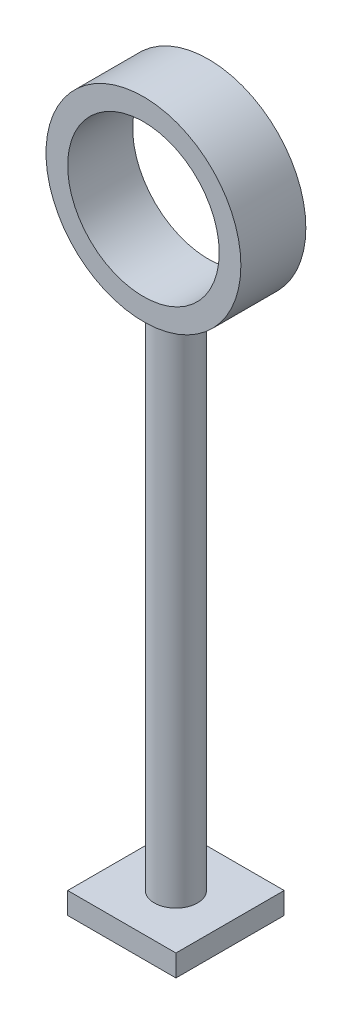
ISO-10303-21;
HEADER;
FILE_DESCRIPTION(('STEP AP214'),'2;1');
FILE_NAME('part.step','',(''),(''),'','','');
FILE_SCHEMA(('AUTOMOTIVE_DESIGN { 1 0 10303 214 1 1 1 1 }'));
ENDSEC;
DATA;
#1=APPLICATION_CONTEXT('core data for automotive mechanical design processes');
#2=APPLICATION_PROTOCOL_DEFINITION('international standard','automotive_design',2000,#1);
#3=PRODUCT_CONTEXT('',#1,'mechanical');
#4=PRODUCT('Part','Part','',(#3));
#5=PRODUCT_RELATED_PRODUCT_CATEGORY('part','',(#4));
#6=PRODUCT_DEFINITION_FORMATION('','',#4);
#7=PRODUCT_DEFINITION_CONTEXT('part definition',#1,'design');
#8=PRODUCT_DEFINITION('design','',#6,#7);
#9=PRODUCT_DEFINITION_SHAPE('','',#8);
#10=(LENGTH_UNIT() NAMED_UNIT(*) SI_UNIT(.MILLI.,.METRE.));
#11=(NAMED_UNIT(*) PLANE_ANGLE_UNIT() SI_UNIT($,.RADIAN.));
#12=(NAMED_UNIT(*) SI_UNIT($,.STERADIAN.) SOLID_ANGLE_UNIT());
#13=UNCERTAINTY_MEASURE_WITH_UNIT(LENGTH_MEASURE(1.E-05),#10,'distance_accuracy_value','');
#14=(GEOMETRIC_REPRESENTATION_CONTEXT(3) GLOBAL_UNCERTAINTY_ASSIGNED_CONTEXT((#13)) GLOBAL_UNIT_ASSIGNED_CONTEXT((#10,
#11,#12)) REPRESENTATION_CONTEXT('',''));
#15=CARTESIAN_POINT('',(0.,0.,0.));
#16=DIRECTION('',(0.,0.,1.));
#17=DIRECTION('',(1.,0.,0.));
#18=AXIS2_PLACEMENT_3D('',#15,#16,#17);
#19=CARTESIAN_POINT('',(0.,0.,15.));
#20=DIRECTION('',(0.,0.,-1.));
#21=DIRECTION('',(-1.,0.,0.));
#22=AXIS2_PLACEMENT_3D('',#19,#20,#21);
#23=CYLINDRICAL_SURFACE('',#22,22.5);
#24=CARTESIAN_POINT('',(0.,0.,15.));
#25=DIRECTION('',(0.,0.,1.));
#26=DIRECTION('',(1.,0.,0.));
#27=AXIS2_PLACEMENT_3D('',#24,#25,#26);
#28=CIRCLE('',#27,22.5);
#29=CARTESIAN_POINT('',(22.5,0.,15.));
#30=VERTEX_POINT('',#29);
#31=EDGE_CURVE('E50',#30,#30,#28,.T.);
#32=ORIENTED_EDGE('',*,*,#31,.F.);
#33=EDGE_LOOP('',(#32));
#34=FACE_BOUND('',#33,.T.);
#35=CARTESIAN_POINT('',(0.,0.,0.));
#36=DIRECTION('',(0.,0.,1.));
#37=DIRECTION('',(1.,0.,0.));
#38=AXIS2_PLACEMENT_3D('',#35,#36,#37);
#39=CIRCLE('',#38,22.5);
#40=CARTESIAN_POINT('',(22.5,0.,0.));
#41=VERTEX_POINT('',#40);
#42=EDGE_CURVE('E124',#41,#41,#39,.T.);
#43=ORIENTED_EDGE('',*,*,#42,.T.);
#44=EDGE_LOOP('',(#43));
#45=FACE_BOUND('',#44,.T.);
#46=CARTESIAN_POINT('',(0.,-22.5,2.5));
#47=CARTESIAN_POINT('',(0.277201191939121,-22.4999949054563,2.50000930919956));
#48=CARTESIAN_POINT('',(0.55451391317405,-22.4948253498923,2.52312995415872));
#49=CARTESIAN_POINT('',(1.10125486025783,-22.4747024439418,2.61490118087639));
#50=CARTESIAN_POINT('',(1.37067743784747,-22.4597422554339,2.68358358502321));
#51=CARTESIAN_POINT('',(1.89365819440382,-22.421702829225,2.86421492622913));
#52=CARTESIAN_POINT('',(2.14723288025071,-22.3986322109764,2.97611794249466));
#53=CARTESIAN_POINT('',(2.63200045078441,-22.3468583860351,3.23986653118103));
#54=CARTESIAN_POINT('',(2.86319376983337,-22.3181552886865,3.3917113282266));
#55=CARTESIAN_POINT('',(3.30046578503508,-22.2577273543527,3.73368916276663));
#56=CARTESIAN_POINT('',(3.50612153010881,-22.2259640410261,3.92435625533762));
#57=CARTESIAN_POINT('',(3.88281227614596,-22.1632650270043,4.33742015023309));
#58=CARTESIAN_POINT('',(4.05384411027149,-22.132329402237,4.55981985177703));
#59=CARTESIAN_POINT('',(4.35831108525865,-22.0744082065066,5.03317961014484));
#60=CARTESIAN_POINT('',(4.49129355260967,-22.0474718934386,5.28443739510044));
#61=CARTESIAN_POINT('',(4.71298247386312,-22.0011524089458,5.80643190423444));
#62=CARTESIAN_POINT('',(4.80169440550397,-21.9817683031266,6.07716621377329));
#63=CARTESIAN_POINT('',(4.93092145016118,-21.9531402359799,6.62583369330533));
#64=CARTESIAN_POINT('',(4.97218667594937,-21.9437386433446,6.90358178774013));
#65=CARTESIAN_POINT('',(5.00768177493916,-21.9356668414217,7.46220554443613));
#66=CARTESIAN_POINT('',(5.00191762279196,-21.9369952689832,7.74308080489217));
#67=CARTESIAN_POINT('',(4.94412068793337,-21.9500908041844,8.29439156798603));
#68=CARTESIAN_POINT('',(4.89296161150565,-21.9616607847499,8.56492406034877));
#69=CARTESIAN_POINT('',(4.74721226702843,-21.993623854663,9.0934678583121));
#70=CARTESIAN_POINT('',(4.65261949204123,-22.0140174532947,9.35147844021339));
#71=CARTESIAN_POINT('',(4.42189182182193,-22.0615227492924,9.85009859595482));
#72=CARTESIAN_POINT('',(4.28542298448383,-22.0886881090716,10.0905483183402));
#73=CARTESIAN_POINT('',(3.97505170349622,-22.1466434477592,10.5454571762897));
#74=CARTESIAN_POINT('',(3.80114400185685,-22.1774339355124,10.7599126545504));
#75=CARTESIAN_POINT('',(3.41621709257458,-22.2400143653192,11.1617732733712));
#76=CARTESIAN_POINT('',(3.20445551316558,-22.2718112671975,11.3484669627626));
#77=CARTESIAN_POINT('',(2.75226654522905,-22.3321959780572,11.6838093222678));
#78=CARTESIAN_POINT('',(2.51183860459343,-22.3607837252105,11.8324572594547));
#79=CARTESIAN_POINT('',(2.00825797683684,-22.4116266058404,12.087673189442));
#80=CARTESIAN_POINT('',(1.74505530579964,-22.4338673251915,12.1941456107706));
#81=CARTESIAN_POINT('',(1.20388982745364,-22.4694034091563,12.3611525326447));
#82=CARTESIAN_POINT('',(0.925929243983414,-22.4827001174196,12.4216939335353));
#83=CARTESIAN_POINT('',(0.369238708202113,-22.4986579440418,12.4940800331379));
#84=CARTESIAN_POINT('',(0.0906409932972646,-22.5015312155572,12.5068962504042));
#85=CARTESIAN_POINT('',(-0.464714809820198,-22.496913966265,12.4861047393491));
#86=CARTESIAN_POINT('',(-0.741473025676616,-22.4894241722617,12.4525002667014));
#87=CARTESIAN_POINT('',(-1.28205814332355,-22.4650564689652,12.3406264620798));
#88=CARTESIAN_POINT('',(-1.5459962292887,-22.4482861751934,12.2628688594414));
#89=CARTESIAN_POINT('',(-2.05708201463959,-22.4072355271705,12.0654657813873));
#90=CARTESIAN_POINT('',(-2.30422825002548,-22.3829545191188,11.9458166592349));
#91=CARTESIAN_POINT('',(-2.77871609973591,-22.3290538306887,11.6660178080026));
#92=CARTESIAN_POINT('',(-3.00571432708049,-22.2993611147475,11.505300142485));
#93=CARTESIAN_POINT('',(-3.42986741247043,-22.2380758087357,11.148671877246));
#94=CARTESIAN_POINT('',(-3.6270182543358,-22.2064829637869,10.9527565491682));
#95=CARTESIAN_POINT('',(-3.98973870477415,-22.1442219736121,10.5268299160498));
#96=CARTESIAN_POINT('',(-4.1546345485,-22.1135829414823,10.2962397749894));
#97=CARTESIAN_POINT('',(-4.44336529807064,-22.0573848845825,9.81006991396707));
#98=CARTESIAN_POINT('',(-4.5672019981812,-22.0318256378478,9.55449128662275));
#99=CARTESIAN_POINT('',(-4.76945004740288,-21.9889300132591,9.02697927725065));
#100=CARTESIAN_POINT('',(-4.84811965884861,-21.9715469897688,8.755148894392));
#101=CARTESIAN_POINT('',(-4.95855069144011,-21.9468912408989,8.20168953791624));
#102=CARTESIAN_POINT('',(-4.99031989295584,-21.9396168385988,7.92006219746525));
#103=CARTESIAN_POINT('',(-5.00570891602905,-21.936110036307,7.36180280427664));
#104=CARTESIAN_POINT('',(-4.99039782859127,-21.9396324581123,7.0852012298064));
#105=CARTESIAN_POINT('',(-4.91445692803306,-21.956766622574,6.53862572505049));
#106=CARTESIAN_POINT('',(-4.85382768500485,-21.9703782383105,6.26865171143571));
#107=CARTESIAN_POINT('',(-4.68949549952189,-22.0060357036517,5.74387719944398));
#108=CARTESIAN_POINT('',(-4.58595291571222,-22.0280501296667,5.48902420779935));
#109=CARTESIAN_POINT('',(-4.33886925870767,-22.078044111629,5.00015001862985));
#110=CARTESIAN_POINT('',(-4.1953238646296,-22.1060243118894,4.76613107508908));
#111=CARTESIAN_POINT('',(-3.8687839747642,-22.1655260709102,4.320308477631));
#112=CARTESIAN_POINT('',(-3.68502963777603,-22.1971092842007,4.10906948769362));
#113=CARTESIAN_POINT('',(-3.28482176486254,-22.2598493543275,3.72007481517144));
#114=CARTESIAN_POINT('',(-3.06836066558357,-22.2910061107244,3.5423268987289));
#115=CARTESIAN_POINT('',(-2.60536492661394,-22.3498814931665,3.22306004270026));
#116=CARTESIAN_POINT('',(-2.35846409158738,-22.3775480874812,3.08206200066269));
#117=CARTESIAN_POINT('',(-1.84390069944704,-22.4258014592307,2.84379173954696));
#118=CARTESIAN_POINT('',(-1.57625550828249,-22.4463940817703,2.74648339988458));
#119=CARTESIAN_POINT('',(-1.09034561932353,-22.474570322739,2.61539662430803));
#120=CARTESIAN_POINT('',(-0.874679979754206,-22.4840467255803,2.57220656583428));
#121=CARTESIAN_POINT('',(-0.43936612473632,-22.4967634364947,2.51450523923461));
#122=CARTESIAN_POINT('',(-0.219718097232196,-22.5000040380903,2.49999262124524));
#123=CARTESIAN_POINT('',(0.,-22.5,2.5));
#124=B_SPLINE_CURVE_WITH_KNOTS('',3,(#46,#47,#48,#49,#50,#51,#52,#53,#54,#55,#56,#57,#58,#59,
#60,#61,#62,#63,#64,#65,#66,#67,#68,#69,#70,#71,#72,#73,#74,#75,#76,#77,#78,#79,#80,#81,#82,#83,
#84,#85,#86,#87,#88,#89,#90,#91,#92,#93,#94,#95,#96,#97,#98,#99,#100,#101,#102,#103,#104,#105,
#106,#107,#108,#109,#110,#111,#112,#113,#114,#115,#116,#117,#118,#119,#120,#121,#122,#123),
.UNSPECIFIED.,.T.,.F.,(4,2,2,2,2,2,2,2,2,2,2,2,2,2,2,2,2,2,2,2,2,2,2,2,2,2,2,2,2,2,2,2,2,2,2,2,
2,2,4),(0.,0.830799224324492,1.66217932812321,2.49267853101865,3.32316161292473,
4.16595180005198,5.00881903726285,5.8613324074494,6.7137402671935,7.55247814098694,
8.39110946248412,9.21394170371394,10.0368214437428,10.8664417428089,11.6961786315269,
12.5444544952938,13.392746699315,14.2429503203503,15.093026187619,15.9256998031761,
16.758315022876,17.5814717356985,18.4047001237058,19.2399950816204,20.0754023347633,
20.9267368277126,21.7780341128296,22.6244139764775,23.4706534172859,24.2978196287089,
25.1249754347416,25.9490678005646,26.7732492148298,27.6146081579908,28.4561619618304,
29.3090646764094,30.1612609469436,30.8198086841341,31.4783254223689),.UNSPECIFIED.);
#125=CARTESIAN_POINT('',(0.,-22.5,2.5));
#126=VERTEX_POINT('',#125);
#127=EDGE_CURVE('E11',#126,#126,#124,.T.);
#128=ORIENTED_EDGE('',*,*,#127,.F.);
#129=EDGE_LOOP('',(#128));
#130=FACE_BOUND('',#129,.T.);
#131=ADVANCED_FACE('F38',(#34,#45,#130),#23,.T.);
#132=CARTESIAN_POINT('',(0.,0.,15.));
#133=DIRECTION('',(0.,0.,1.));
#134=DIRECTION('',(1.,0.,0.));
#135=AXIS2_PLACEMENT_3D('',#132,#133,#134);
#136=PLANE('',#135);
#137=ORIENTED_EDGE('',*,*,#31,.T.);
#138=EDGE_LOOP('',(#137));
#139=FACE_BOUND('',#138,.T.);
#140=CARTESIAN_POINT('',(0.,0.,15.));
#141=DIRECTION('',(0.,0.,1.));
#142=DIRECTION('',(1.,0.,0.));
#143=AXIS2_PLACEMENT_3D('',#140,#141,#142);
#144=CIRCLE('',#143,17.5);
#145=CARTESIAN_POINT('',(17.5,0.,15.));
#146=VERTEX_POINT('',#145);
#147=EDGE_CURVE('E121',#146,#146,#144,.T.);
#148=ORIENTED_EDGE('',*,*,#147,.F.);
#149=EDGE_LOOP('',(#148));
#150=FACE_BOUND('',#149,.T.);
#151=ADVANCED_FACE('F137',(#139,#150),#136,.T.);
#152=CARTESIAN_POINT('',(0.,0.,0.));
#153=DIRECTION('',(0.,0.,1.));
#154=DIRECTION('',(1.,0.,0.));
#155=AXIS2_PLACEMENT_3D('',#152,#153,#154);
#156=PLANE('',#155);
#157=ORIENTED_EDGE('',*,*,#42,.F.);
#158=EDGE_LOOP('',(#157));
#159=FACE_BOUND('',#158,.T.);
#160=CARTESIAN_POINT('',(0.,0.,0.));
#161=DIRECTION('',(0.,0.,1.));
#162=DIRECTION('',(1.,0.,0.));
#163=AXIS2_PLACEMENT_3D('',#160,#161,#162);
#164=CIRCLE('',#163,17.5);
#165=CARTESIAN_POINT('',(17.5,0.,0.));
#166=VERTEX_POINT('',#165);
#167=EDGE_CURVE('E120',#166,#166,#164,.T.);
#168=ORIENTED_EDGE('',*,*,#167,.T.);
#169=EDGE_LOOP('',(#168));
#170=FACE_BOUND('',#169,.T.);
#171=ADVANCED_FACE('F133',(#159,#170),#156,.F.);
#172=CARTESIAN_POINT('',(0.,0.,15.));
#173=DIRECTION('',(0.,0.,-1.));
#174=DIRECTION('',(-1.,0.,0.));
#175=AXIS2_PLACEMENT_3D('',#172,#173,#174);
#176=CYLINDRICAL_SURFACE('',#175,17.5);
#177=ORIENTED_EDGE('',*,*,#147,.T.);
#178=EDGE_LOOP('',(#177));
#179=FACE_BOUND('',#178,.T.);
#180=ORIENTED_EDGE('',*,*,#167,.F.);
#181=EDGE_LOOP('',(#180));
#182=FACE_BOUND('',#181,.T.);
#183=ADVANCED_FACE('F136',(#179,#182),#176,.F.);
#184=CARTESIAN_POINT('',(0.,22.502,7.5));
#185=DIRECTION('',(0.,-1.,0.));
#186=DIRECTION('',(0.,0.,-1.));
#187=AXIS2_PLACEMENT_3D('',#184,#185,#186);
#188=CYLINDRICAL_SURFACE('',#187,5.);
#189=CARTESIAN_POINT('',(0.,-140.,7.5));
#190=DIRECTION('',(0.,1.,0.));
#191=DIRECTION('',(0.,0.,1.));
#192=AXIS2_PLACEMENT_3D('',#189,#190,#191);
#193=CIRCLE('',#192,5.);
#194=CARTESIAN_POINT('',(0.,-140.,12.5));
#195=VERTEX_POINT('',#194);
#196=EDGE_CURVE('E117',#195,#195,#193,.T.);
#197=ORIENTED_EDGE('',*,*,#196,.T.);
#198=EDGE_LOOP('',(#197));
#199=FACE_BOUND('',#198,.T.);
#200=ORIENTED_EDGE('',*,*,#127,.T.);
#201=EDGE_LOOP('',(#200));
#202=FACE_BOUND('',#201,.T.);
#203=ADVANCED_FACE('F141',(#199,#202),#188,.T.);
#204=CARTESIAN_POINT('',(12.5,-180.355339059327,20.));
#205=DIRECTION('',(-1.,0.,0.));
#206=DIRECTION('',(0.,0.,1.));
#207=AXIS2_PLACEMENT_3D('',#204,#205,#206);
#208=PLANE('',#207);
#209=DIRECTION('',(0.,0.,1.));
#210=VECTOR('',#209,1.);
#211=CARTESIAN_POINT('',(12.5,-144.999999999999,20.));
#212=LINE('',#211,#210);
#213=CARTESIAN_POINT('',(12.5,-144.999999999999,-5.));
#214=VERTEX_POINT('',#213);
#215=CARTESIAN_POINT('',(12.5,-144.999999999999,20.));
#216=VERTEX_POINT('',#215);
#217=EDGE_CURVE('E57',#214,#216,#212,.T.);
#218=ORIENTED_EDGE('',*,*,#217,.F.);
#219=DIRECTION('',(0.,1.,0.));
#220=VECTOR('',#219,1.);
#221=CARTESIAN_POINT('',(12.5,-180.355339059327,-5.));
#222=LINE('',#221,#220);
#223=CARTESIAN_POINT('',(12.5,-140.,-5.));
#224=VERTEX_POINT('',#223);
#225=EDGE_CURVE('E102',#214,#224,#222,.T.);
#226=ORIENTED_EDGE('',*,*,#225,.T.);
#227=DIRECTION('',(0.,0.,1.));
#228=VECTOR('',#227,1.);
#229=CARTESIAN_POINT('',(12.5,-140.,20.));
#230=LINE('',#229,#228);
#231=CARTESIAN_POINT('',(12.5,-140.,20.));
#232=VERTEX_POINT('',#231);
#233=EDGE_CURVE('E96',#224,#232,#230,.T.);
#234=ORIENTED_EDGE('',*,*,#233,.T.);
#235=DIRECTION('',(0.,1.,0.));
#236=VECTOR('',#235,1.);
#237=CARTESIAN_POINT('',(12.5,-180.355339059327,20.));
#238=LINE('',#237,#236);
#239=EDGE_CURVE('E81',#216,#232,#238,.T.);
#240=ORIENTED_EDGE('',*,*,#239,.F.);
#241=EDGE_LOOP('',(#218,#226,#234,#240));
#242=FACE_BOUND('',#241,.T.);
#243=ADVANCED_FACE('F100',(#242),#208,.F.);
#244=CARTESIAN_POINT('',(-12.5,-180.355339059327,20.));
#245=DIRECTION('',(0.,0.,-1.));
#246=DIRECTION('',(-1.,0.,0.));
#247=AXIS2_PLACEMENT_3D('',#244,#245,#246);
#248=PLANE('',#247);
#249=DIRECTION('',(-1.,0.,0.));
#250=VECTOR('',#249,1.);
#251=CARTESIAN_POINT('',(-12.5,-144.999999999999,20.));
#252=LINE('',#251,#250);
#253=CARTESIAN_POINT('',(-12.5,-144.999999999999,20.));
#254=VERTEX_POINT('',#253);
#255=EDGE_CURVE('E61',#216,#254,#252,.T.);
#256=ORIENTED_EDGE('',*,*,#255,.F.);
#257=ORIENTED_EDGE('',*,*,#239,.T.);
#258=DIRECTION('',(-1.,0.,0.));
#259=VECTOR('',#258,1.);
#260=CARTESIAN_POINT('',(-12.5,-140.,20.));
#261=LINE('',#260,#259);
#262=CARTESIAN_POINT('',(-12.5,-140.,20.));
#263=VERTEX_POINT('',#262);
#264=EDGE_CURVE('E85',#232,#263,#261,.T.);
#265=ORIENTED_EDGE('',*,*,#264,.T.);
#266=DIRECTION('',(0.,1.,0.));
#267=VECTOR('',#266,1.);
#268=CARTESIAN_POINT('',(-12.5,-180.355339059327,20.));
#269=LINE('',#268,#267);
#270=EDGE_CURVE('E90',#254,#263,#269,.T.);
#271=ORIENTED_EDGE('',*,*,#270,.F.);
#272=EDGE_LOOP('',(#256,#257,#265,#271));
#273=FACE_BOUND('',#272,.T.);
#274=ADVANCED_FACE('F83',(#273),#248,.F.);
#275=CARTESIAN_POINT('',(-12.5,-180.355339059327,20.));
#276=DIRECTION('',(1.,0.,0.));
#277=DIRECTION('',(0.,0.,-1.));
#278=AXIS2_PLACEMENT_3D('',#275,#276,#277);
#279=PLANE('',#278);
#280=DIRECTION('',(0.,0.,-1.));
#281=VECTOR('',#280,1.);
#282=CARTESIAN_POINT('',(-12.5,-144.999999999999,20.));
#283=LINE('',#282,#281);
#284=CARTESIAN_POINT('',(-12.5,-144.999999999999,-5.));
#285=VERTEX_POINT('',#284);
#286=EDGE_CURVE('E89',#254,#285,#283,.T.);
#287=ORIENTED_EDGE('',*,*,#286,.F.);
#288=ORIENTED_EDGE('',*,*,#270,.T.);
#289=DIRECTION('',(0.,0.,-1.));
#290=VECTOR('',#289,1.);
#291=CARTESIAN_POINT('',(-12.5,-140.,20.));
#292=LINE('',#291,#290);
#293=CARTESIAN_POINT('',(-12.5,-140.,-5.));
#294=VERTEX_POINT('',#293);
#295=EDGE_CURVE('E98',#263,#294,#292,.T.);
#296=ORIENTED_EDGE('',*,*,#295,.T.);
#297=DIRECTION('',(0.,1.,0.));
#298=VECTOR('',#297,1.);
#299=CARTESIAN_POINT('',(-12.5,-180.355339059327,-5.));
#300=LINE('',#299,#298);
#301=EDGE_CURVE('E112',#285,#294,#300,.T.);
#302=ORIENTED_EDGE('',*,*,#301,.F.);
#303=EDGE_LOOP('',(#287,#288,#296,#302));
#304=FACE_BOUND('',#303,.T.);
#305=ADVANCED_FACE('F195',(#304),#279,.F.);
#306=CARTESIAN_POINT('',(-12.5,-180.355339059327,-5.));
#307=DIRECTION('',(0.,0.,1.));
#308=DIRECTION('',(1.,0.,0.));
#309=AXIS2_PLACEMENT_3D('',#306,#307,#308);
#310=PLANE('',#309);
#311=DIRECTION('',(1.,0.,0.));
#312=VECTOR('',#311,1.);
#313=CARTESIAN_POINT('',(-12.5,-144.999999999999,-5.));
#314=LINE('',#313,#312);
#315=EDGE_CURVE('E115',#285,#214,#314,.T.);
#316=ORIENTED_EDGE('',*,*,#315,.F.);
#317=ORIENTED_EDGE('',*,*,#301,.T.);
#318=DIRECTION('',(1.,0.,0.));
#319=VECTOR('',#318,1.);
#320=CARTESIAN_POINT('',(-12.5,-140.,-5.));
#321=LINE('',#320,#319);
#322=EDGE_CURVE('E109',#294,#224,#321,.T.);
#323=ORIENTED_EDGE('',*,*,#322,.T.);
#324=ORIENTED_EDGE('',*,*,#225,.F.);
#325=EDGE_LOOP('',(#316,#317,#323,#324));
#326=FACE_BOUND('',#325,.T.);
#327=ADVANCED_FACE('F204',(#326),#310,.F.);
#328=CARTESIAN_POINT('',(0.,-140.,0.));
#329=DIRECTION('',(0.,-1.,0.));
#330=DIRECTION('',(0.,0.,-1.));
#331=AXIS2_PLACEMENT_3D('',#328,#329,#330);
#332=PLANE('',#331);
#333=ORIENTED_EDGE('',*,*,#196,.F.);
#334=EDGE_LOOP('',(#333));
#335=FACE_BOUND('',#334,.T.);
#336=ORIENTED_EDGE('',*,*,#233,.F.);
#337=ORIENTED_EDGE('',*,*,#322,.F.);
#338=ORIENTED_EDGE('',*,*,#295,.F.);
#339=ORIENTED_EDGE('',*,*,#264,.F.);
#340=EDGE_LOOP('',(#336,#337,#338,#339));
#341=FACE_BOUND('',#340,.T.);
#342=ADVANCED_FACE('F94',(#335,#341),#332,.F.);
#343=CARTESIAN_POINT('',(44.3588153713722,-144.999999999999,82.2689033011884));
#344=DIRECTION('',(0.,-1.,0.));
#345=DIRECTION('',(0.,0.,1.));
#346=AXIS2_PLACEMENT_3D('',#343,#344,#345);
#347=PLANE('',#346);
#348=ORIENTED_EDGE('',*,*,#217,.T.);
#349=ORIENTED_EDGE('',*,*,#255,.T.);
#350=ORIENTED_EDGE('',*,*,#286,.T.);
#351=ORIENTED_EDGE('',*,*,#315,.T.);
#352=EDGE_LOOP('',(#348,#349,#350,#351));
#353=FACE_BOUND('',#352,.T.);
#354=ADVANCED_FACE('F223',(#353),#347,.T.);
#355=CLOSED_SHELL('',(#131,#151,#171,#183,#203,#243,#274,#305,#327,#342,#354));
#356=MANIFOLD_SOLID_BREP('B2',#355);
#357=ADVANCED_BREP_SHAPE_REPRESENTATION('',(#18,#356),#14);
#358=SHAPE_DEFINITION_REPRESENTATION(#9,#357);
ENDSEC;
END-ISO-10303-21;
